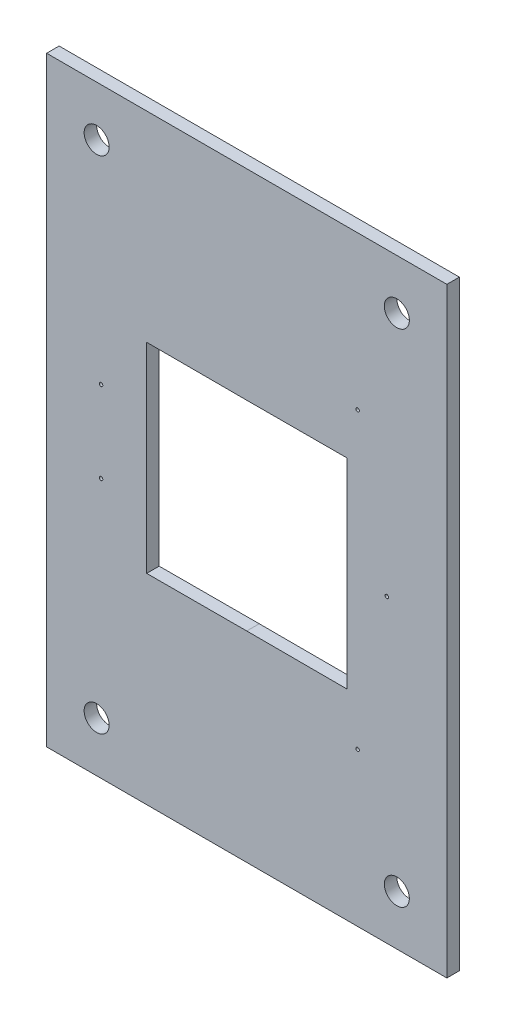
ISO-10303-21;
HEADER;
FILE_DESCRIPTION(('STEP AP214'),'2;1');
FILE_NAME('part.step','',(''),(''),'','','');
FILE_SCHEMA(('AUTOMOTIVE_DESIGN { 1 0 10303 214 1 1 1 1 }'));
ENDSEC;
DATA;
#1=APPLICATION_CONTEXT('core data for automotive mechanical design processes');
#2=APPLICATION_PROTOCOL_DEFINITION('international standard','automotive_design',2000,#1);
#3=PRODUCT_CONTEXT('',#1,'mechanical');
#4=PRODUCT('Part','Part','',(#3));
#5=PRODUCT_RELATED_PRODUCT_CATEGORY('part','',(#4));
#6=PRODUCT_DEFINITION_FORMATION('','',#4);
#7=PRODUCT_DEFINITION_CONTEXT('part definition',#1,'design');
#8=PRODUCT_DEFINITION('design','',#6,#7);
#9=PRODUCT_DEFINITION_SHAPE('','',#8);
#10=(LENGTH_UNIT() NAMED_UNIT(*) SI_UNIT(.MILLI.,.METRE.));
#11=(NAMED_UNIT(*) PLANE_ANGLE_UNIT() SI_UNIT($,.RADIAN.));
#12=(NAMED_UNIT(*) SI_UNIT($,.STERADIAN.) SOLID_ANGLE_UNIT());
#13=UNCERTAINTY_MEASURE_WITH_UNIT(LENGTH_MEASURE(1.E-05),#10,'distance_accuracy_value','');
#14=(GEOMETRIC_REPRESENTATION_CONTEXT(3) GLOBAL_UNCERTAINTY_ASSIGNED_CONTEXT((#13)) GLOBAL_UNIT_ASSIGNED_CONTEXT((#10,
#11,#12)) REPRESENTATION_CONTEXT('',''));
#15=CARTESIAN_POINT('',(0.,0.,0.));
#16=DIRECTION('',(0.,0.,1.));
#17=DIRECTION('',(1.,0.,0.));
#18=AXIS2_PLACEMENT_3D('',#15,#16,#17);
#19=CARTESIAN_POINT('',(390.62322075841,-119.382866825625,3.175));
#20=DIRECTION('',(0.,0.,-1.));
#21=DIRECTION('',(-1.,0.,0.));
#22=AXIS2_PLACEMENT_3D('',#19,#20,#21);
#23=PLANE('',#22);
#24=CARTESIAN_POINT('',(377.92322075841,-106.682866825625,3.175));
#25=DIRECTION('',(0.,0.,1.));
#26=DIRECTION('',(-1.,0.,0.));
#27=AXIS2_PLACEMENT_3D('',#24,#25,#26);
#28=CIRCLE('',#27,3.17499999999996);
#29=CARTESIAN_POINT('',(374.74822075841,-106.682866825625,3.175));
#30=VERTEX_POINT('',#29);
#31=EDGE_CURVE('E235',#30,#30,#28,.T.);
#32=ORIENTED_EDGE('',*,*,#31,.F.);
#33=EDGE_LOOP('',(#32));
#34=FACE_BOUND('',#33,.T.);
#35=CARTESIAN_POINT('',(301.72322075841,-106.682866825625,3.175));
#36=DIRECTION('',(0.,0.,1.));
#37=DIRECTION('',(1.,0.,0.));
#38=AXIS2_PLACEMENT_3D('',#35,#36,#37);
#39=CIRCLE('',#38,3.17499999999996);
#40=CARTESIAN_POINT('',(304.89822075841,-106.682866825625,3.175));
#41=VERTEX_POINT('',#40);
#42=EDGE_CURVE('E225',#41,#41,#39,.T.);
#43=ORIENTED_EDGE('',*,*,#42,.F.);
#44=EDGE_LOOP('',(#43));
#45=FACE_BOUND('',#44,.T.);
#46=CARTESIAN_POINT('',(301.72322075841,20.4080385220846,3.175));
#47=DIRECTION('',(0.,0.,1.));
#48=DIRECTION('',(-1.,0.,0.));
#49=AXIS2_PLACEMENT_3D('',#46,#47,#48);
#50=CIRCLE('',#49,3.17499999999997);
#51=CARTESIAN_POINT('',(298.54822075841,20.4080385220846,3.175));
#52=VERTEX_POINT('',#51);
#53=EDGE_CURVE('E222',#52,#52,#50,.T.);
#54=ORIENTED_EDGE('',*,*,#53,.F.);
#55=EDGE_LOOP('',(#54));
#56=FACE_BOUND('',#55,.T.);
#57=CARTESIAN_POINT('',(377.92322075841,20.4080385220846,3.175));
#58=DIRECTION('',(0.,0.,1.));
#59=DIRECTION('',(1.,0.,0.));
#60=AXIS2_PLACEMENT_3D('',#57,#58,#59);
#61=CIRCLE('',#60,3.17499999999997);
#62=CARTESIAN_POINT('',(381.09822075841,20.4080385220846,3.175));
#63=VERTEX_POINT('',#62);
#64=EDGE_CURVE('E219',#63,#63,#61,.T.);
#65=ORIENTED_EDGE('',*,*,#64,.F.);
#66=EDGE_LOOP('',(#65));
#67=FACE_BOUND('',#66,.T.);
#68=DIRECTION('',(0.,-1.,0.));
#69=VECTOR('',#68,1.);
#70=CARTESIAN_POINT('',(314.42322075841,-17.7374141517705,3.175));
#71=LINE('',#70,#69);
#72=CARTESIAN_POINT('',(314.42322075841,-17.7374141517705,3.175));
#73=VERTEX_POINT('',#72);
#74=CARTESIAN_POINT('',(314.42322075841,-68.53741415177,3.175));
#75=VERTEX_POINT('',#74);
#76=EDGE_CURVE('E112',#73,#75,#71,.T.);
#77=ORIENTED_EDGE('',*,*,#76,.F.);
#78=DIRECTION('',(-0.999998705948562,0.00160875765775456,0.));
#79=VECTOR('',#78,1.);
#80=CARTESIAN_POINT('',(314.42322075841,-17.7374141517705,3.175));
#81=LINE('',#80,#79);
#82=CARTESIAN_POINT('',(339.82322075841,-17.7782766491557,3.175));
#83=VERTEX_POINT('',#82);
#84=EDGE_CURVE('E143',#83,#73,#81,.T.);
#85=ORIENTED_EDGE('',*,*,#84,.F.);
#86=DIRECTION('',(-0.999998705948562,-0.00160875765775456,0.));
#87=VECTOR('',#86,1.);
#88=CARTESIAN_POINT('',(365.22322075841,-17.7374141517705,3.175));
#89=LINE('',#88,#87);
#90=CARTESIAN_POINT('',(365.22322075841,-17.7374141517705,3.175));
#91=VERTEX_POINT('',#90);
#92=EDGE_CURVE('E141',#91,#83,#89,.T.);
#93=ORIENTED_EDGE('',*,*,#92,.F.);
#94=DIRECTION('',(0.,1.,0.));
#95=VECTOR('',#94,1.);
#96=CARTESIAN_POINT('',(365.22322075841,-17.7374141517705,3.175));
#97=LINE('',#96,#95);
#98=CARTESIAN_POINT('',(365.22322075841,-68.5374141517696,3.175));
#99=VERTEX_POINT('',#98);
#100=EDGE_CURVE('E136',#99,#91,#97,.T.);
#101=ORIENTED_EDGE('',*,*,#100,.F.);
#102=DIRECTION('',(0.999998705948562,-0.00160875765774677,0.));
#103=VECTOR('',#102,1.);
#104=CARTESIAN_POINT('',(365.22322075841,-68.5374141517696,3.175));
#105=LINE('',#104,#103);
#106=CARTESIAN_POINT('',(339.82322075841,-68.4965516543847,3.175));
#107=VERTEX_POINT('',#106);
#108=EDGE_CURVE('E134',#107,#99,#105,.T.);
#109=ORIENTED_EDGE('',*,*,#108,.F.);
#110=DIRECTION('',(0.999998705948562,0.00160875765776207,0.));
#111=VECTOR('',#110,1.);
#112=CARTESIAN_POINT('',(314.42322075841,-68.53741415177,3.175));
#113=LINE('',#112,#111);
#114=EDGE_CURVE('E120',#75,#107,#113,.T.);
#115=ORIENTED_EDGE('',*,*,#114,.F.);
#116=EDGE_LOOP('',(#77,#85,#93,#101,#109,#115));
#117=FACE_BOUND('',#116,.T.);
#118=CARTESIAN_POINT('',(375.390273380605,-43.1374141517705,3.175));
#119=DIRECTION('',(0.,0.,1.));
#120=DIRECTION('',(1.,0.,0.));
#121=AXIS2_PLACEMENT_3D('',#118,#119,#120);
#122=CIRCLE('',#121,0.450000000000002);
#123=CARTESIAN_POINT('',(375.840273380605,-43.1374141517705,3.175));
#124=VERTEX_POINT('',#123);
#125=EDGE_CURVE('E172',#124,#124,#122,.T.);
#126=ORIENTED_EDGE('',*,*,#125,.F.);
#127=EDGE_LOOP('',(#126));
#128=FACE_BOUND('',#127,.T.);
#129=CARTESIAN_POINT('',(302.83502075841,-32.8049614779154,3.175));
#130=DIRECTION('',(0.,0.,1.));
#131=DIRECTION('',(1.,0.,0.));
#132=AXIS2_PLACEMENT_3D('',#129,#130,#131);
#133=CIRCLE('',#132,0.450000000000002);
#134=CARTESIAN_POINT('',(303.28502075841,-32.8049614779154,3.175));
#135=VERTEX_POINT('',#134);
#136=EDGE_CURVE('E184',#135,#135,#133,.T.);
#137=ORIENTED_EDGE('',*,*,#136,.F.);
#138=EDGE_LOOP('',(#137));
#139=FACE_BOUND('',#138,.T.);
#140=DIRECTION('',(1.,0.,0.));
#141=VECTOR('',#140,1.);
#142=CARTESIAN_POINT('',(289.02322075841,-119.382866825625,3.175));
#143=LINE('',#142,#141);
#144=CARTESIAN_POINT('',(289.02322075841,-119.382866825625,3.175));
#145=VERTEX_POINT('',#144);
#146=CARTESIAN_POINT('',(390.62322075841,-119.382866825625,3.175));
#147=VERTEX_POINT('',#146);
#148=EDGE_CURVE('E190',#145,#147,#143,.T.);
#149=ORIENTED_EDGE('',*,*,#148,.T.);
#150=DIRECTION('',(0.,1.,0.));
#151=VECTOR('',#150,1.);
#152=CARTESIAN_POINT('',(390.62322075841,33.1080385220846,3.175));
#153=LINE('',#152,#151);
#154=CARTESIAN_POINT('',(390.62322075841,33.1080385220846,3.175));
#155=VERTEX_POINT('',#154);
#156=EDGE_CURVE('E193',#147,#155,#153,.T.);
#157=ORIENTED_EDGE('',*,*,#156,.T.);
#158=DIRECTION('',(-1.,0.,0.));
#159=VECTOR('',#158,1.);
#160=CARTESIAN_POINT('',(390.62322075841,33.1080385220846,3.175));
#161=LINE('',#160,#159);
#162=CARTESIAN_POINT('',(289.02322075841,33.1080385220846,3.175));
#163=VERTEX_POINT('',#162);
#164=EDGE_CURVE('E196',#155,#163,#161,.T.);
#165=ORIENTED_EDGE('',*,*,#164,.T.);
#166=DIRECTION('',(0.,-1.,0.));
#167=VECTOR('',#166,1.);
#168=CARTESIAN_POINT('',(289.02322075841,33.1080385220846,3.175));
#169=LINE('',#168,#167);
#170=EDGE_CURVE('E198',#163,#145,#169,.T.);
#171=ORIENTED_EDGE('',*,*,#170,.T.);
#172=EDGE_LOOP('',(#149,#157,#165,#171));
#173=FACE_BOUND('',#172,.T.);
#174=CARTESIAN_POINT('',(367.968527800456,-5.82577949617655,3.175));
#175=DIRECTION('',(0.,0.,1.));
#176=DIRECTION('',(1.,0.,0.));
#177=AXIS2_PLACEMENT_3D('',#174,#175,#176);
#178=CIRCLE('',#177,0.450000000000002);
#179=CARTESIAN_POINT('',(368.418527800456,-5.82577949617655,3.175));
#180=VERTEX_POINT('',#179);
#181=EDGE_CURVE('E178',#180,#180,#178,.T.);
#182=ORIENTED_EDGE('',*,*,#181,.F.);
#183=EDGE_LOOP('',(#182));
#184=FACE_BOUND('',#183,.T.);
#185=CARTESIAN_POINT('',(302.83502075841,-53.4698668256257,3.175));
#186=DIRECTION('',(0.,0.,1.));
#187=DIRECTION('',(-1.,0.,0.));
#188=AXIS2_PLACEMENT_3D('',#185,#186,#187);
#189=CIRCLE('',#188,0.450000000000004);
#190=CARTESIAN_POINT('',(302.38502075841,-53.4698668256257,3.175));
#191=VERTEX_POINT('',#190);
#192=EDGE_CURVE('E166',#191,#191,#189,.T.);
#193=ORIENTED_EDGE('',*,*,#192,.F.);
#194=EDGE_LOOP('',(#193));
#195=FACE_BOUND('',#194,.T.);
#196=CARTESIAN_POINT('',(367.968527800455,-80.449048807366,3.175));
#197=DIRECTION('',(0.,0.,1.));
#198=DIRECTION('',(-1.,0.,0.));
#199=AXIS2_PLACEMENT_3D('',#196,#197,#198);
#200=CIRCLE('',#199,0.450000000000012);
#201=CARTESIAN_POINT('',(367.518527800455,-80.449048807366,3.175));
#202=VERTEX_POINT('',#201);
#203=EDGE_CURVE('E146',#202,#202,#200,.T.);
#204=ORIENTED_EDGE('',*,*,#203,.F.);
#205=EDGE_LOOP('',(#204));
#206=FACE_BOUND('',#205,.T.);
#207=ADVANCED_FACE('F33',(#34,#45,#56,#67,#117,#128,#139,#173,#184,#195,#206),#23,.F.);
#208=CARTESIAN_POINT('',(390.62322075841,-119.382866825625,0.));
#209=DIRECTION('',(0.,0.,-1.));
#210=DIRECTION('',(-1.,0.,0.));
#211=AXIS2_PLACEMENT_3D('',#208,#209,#210);
#212=PLANE('',#211);
#213=CARTESIAN_POINT('',(377.92322075841,-106.682866825625,0.));
#214=DIRECTION('',(0.,0.,-1.));
#215=DIRECTION('',(-1.,0.,0.));
#216=AXIS2_PLACEMENT_3D('',#213,#214,#215);
#217=CIRCLE('',#216,3.17499999999996);
#218=CARTESIAN_POINT('',(374.74822075841,-106.682866825625,0.));
#219=VERTEX_POINT('',#218);
#220=EDGE_CURVE('E37',#219,#219,#217,.T.);
#221=ORIENTED_EDGE('',*,*,#220,.F.);
#222=EDGE_LOOP('',(#221));
#223=FACE_BOUND('',#222,.T.);
#224=CARTESIAN_POINT('',(301.72322075841,-106.682866825625,0.));
#225=DIRECTION('',(0.,0.,-1.));
#226=DIRECTION('',(-1.,0.,0.));
#227=AXIS2_PLACEMENT_3D('',#224,#225,#226);
#228=CIRCLE('',#227,3.17499999999996);
#229=CARTESIAN_POINT('',(298.54822075841,-106.682866825625,0.));
#230=VERTEX_POINT('',#229);
#231=EDGE_CURVE('E223',#230,#230,#228,.T.);
#232=ORIENTED_EDGE('',*,*,#231,.F.);
#233=EDGE_LOOP('',(#232));
#234=FACE_BOUND('',#233,.T.);
#235=CARTESIAN_POINT('',(301.72322075841,20.4080385220846,0.));
#236=DIRECTION('',(0.,0.,-1.));
#237=DIRECTION('',(-1.,0.,0.));
#238=AXIS2_PLACEMENT_3D('',#235,#236,#237);
#239=CIRCLE('',#238,3.17499999999997);
#240=CARTESIAN_POINT('',(298.54822075841,20.4080385220846,0.));
#241=VERTEX_POINT('',#240);
#242=EDGE_CURVE('E220',#241,#241,#239,.T.);
#243=ORIENTED_EDGE('',*,*,#242,.F.);
#244=EDGE_LOOP('',(#243));
#245=FACE_BOUND('',#244,.T.);
#246=CARTESIAN_POINT('',(377.92322075841,20.4080385220846,0.));
#247=DIRECTION('',(0.,0.,-1.));
#248=DIRECTION('',(-1.,0.,0.));
#249=AXIS2_PLACEMENT_3D('',#246,#247,#248);
#250=CIRCLE('',#249,3.17499999999997);
#251=CARTESIAN_POINT('',(374.74822075841,20.4080385220846,0.));
#252=VERTEX_POINT('',#251);
#253=EDGE_CURVE('E215',#252,#252,#250,.T.);
#254=ORIENTED_EDGE('',*,*,#253,.F.);
#255=EDGE_LOOP('',(#254));
#256=FACE_BOUND('',#255,.T.);
#257=DIRECTION('',(-0.999998705948562,0.00160875765775456,0.));
#258=VECTOR('',#257,1.);
#259=CARTESIAN_POINT('',(314.42322075841,-17.7374141517705,0.));
#260=LINE('',#259,#258);
#261=CARTESIAN_POINT('',(339.82322075841,-17.7782766491557,0.));
#262=VERTEX_POINT('',#261);
#263=CARTESIAN_POINT('',(314.42322075841,-17.7374141517706,0.));
#264=VERTEX_POINT('',#263);
#265=EDGE_CURVE('E121',#262,#264,#260,.T.);
#266=ORIENTED_EDGE('',*,*,#265,.T.);
#267=DIRECTION('',(0.,-1.,0.));
#268=VECTOR('',#267,1.);
#269=CARTESIAN_POINT('',(314.42322075841,-17.7374141517705,0.));
#270=LINE('',#269,#268);
#271=CARTESIAN_POINT('',(314.42322075841,-68.53741415177,0.));
#272=VERTEX_POINT('',#271);
#273=EDGE_CURVE('E58',#264,#272,#270,.T.);
#274=ORIENTED_EDGE('',*,*,#273,.T.);
#275=DIRECTION('',(0.999998705948562,0.00160875765776207,0.));
#276=VECTOR('',#275,1.);
#277=CARTESIAN_POINT('',(314.42322075841,-68.53741415177,0.));
#278=LINE('',#277,#276);
#279=CARTESIAN_POINT('',(339.82322075841,-68.4965516543847,0.));
#280=VERTEX_POINT('',#279);
#281=EDGE_CURVE('E127',#272,#280,#278,.T.);
#282=ORIENTED_EDGE('',*,*,#281,.T.);
#283=DIRECTION('',(0.999998705948562,-0.00160875765774677,0.));
#284=VECTOR('',#283,1.);
#285=CARTESIAN_POINT('',(365.22322075841,-68.5374141517696,0.));
#286=LINE('',#285,#284);
#287=CARTESIAN_POINT('',(365.22322075841,-68.5374141517696,0.));
#288=VERTEX_POINT('',#287);
#289=EDGE_CURVE('E148',#280,#288,#286,.T.);
#290=ORIENTED_EDGE('',*,*,#289,.T.);
#291=DIRECTION('',(0.,1.,0.));
#292=VECTOR('',#291,1.);
#293=CARTESIAN_POINT('',(365.22322075841,-17.7374141517705,0.));
#294=LINE('',#293,#292);
#295=CARTESIAN_POINT('',(365.22322075841,-17.7374141517705,0.));
#296=VERTEX_POINT('',#295);
#297=EDGE_CURVE('E151',#288,#296,#294,.T.);
#298=ORIENTED_EDGE('',*,*,#297,.T.);
#299=DIRECTION('',(-0.999998705948562,-0.00160875765775456,0.));
#300=VECTOR('',#299,1.);
#301=CARTESIAN_POINT('',(365.22322075841,-17.7374141517705,0.));
#302=LINE('',#301,#300);
#303=EDGE_CURVE('E154',#296,#262,#302,.T.);
#304=ORIENTED_EDGE('',*,*,#303,.T.);
#305=EDGE_LOOP('',(#266,#274,#282,#290,#298,#304));
#306=FACE_BOUND('',#305,.T.);
#307=CARTESIAN_POINT('',(375.390273380605,-43.1374141517705,0.));
#308=DIRECTION('',(0.,0.,1.));
#309=DIRECTION('',(1.,0.,0.));
#310=AXIS2_PLACEMENT_3D('',#307,#308,#309);
#311=CIRCLE('',#310,0.450000000000002);
#312=CARTESIAN_POINT('',(375.840273380605,-43.1374141517705,0.));
#313=VERTEX_POINT('',#312);
#314=EDGE_CURVE('E169',#313,#313,#311,.T.);
#315=ORIENTED_EDGE('',*,*,#314,.T.);
#316=EDGE_LOOP('',(#315));
#317=FACE_BOUND('',#316,.T.);
#318=CARTESIAN_POINT('',(302.83502075841,-32.8049614779154,0.));
#319=DIRECTION('',(0.,0.,1.));
#320=DIRECTION('',(1.,0.,0.));
#321=AXIS2_PLACEMENT_3D('',#318,#319,#320);
#322=CIRCLE('',#321,0.450000000000002);
#323=CARTESIAN_POINT('',(303.28502075841,-32.8049614779154,0.));
#324=VERTEX_POINT('',#323);
#325=EDGE_CURVE('E181',#324,#324,#322,.T.);
#326=ORIENTED_EDGE('',*,*,#325,.T.);
#327=EDGE_LOOP('',(#326));
#328=FACE_BOUND('',#327,.T.);
#329=DIRECTION('',(1.,0.,0.));
#330=VECTOR('',#329,1.);
#331=CARTESIAN_POINT('',(289.02322075841,-119.382866825625,0.));
#332=LINE('',#331,#330);
#333=CARTESIAN_POINT('',(289.02322075841,-119.382866825625,0.));
#334=VERTEX_POINT('',#333);
#335=CARTESIAN_POINT('',(390.62322075841,-119.382866825625,0.));
#336=VERTEX_POINT('',#335);
#337=EDGE_CURVE('E187',#334,#336,#332,.T.);
#338=ORIENTED_EDGE('',*,*,#337,.F.);
#339=DIRECTION('',(0.,-1.,0.));
#340=VECTOR('',#339,1.);
#341=CARTESIAN_POINT('',(289.02322075841,33.1080385220846,0.));
#342=LINE('',#341,#340);
#343=CARTESIAN_POINT('',(289.02322075841,33.1080385220846,0.));
#344=VERTEX_POINT('',#343);
#345=EDGE_CURVE('E194',#344,#334,#342,.T.);
#346=ORIENTED_EDGE('',*,*,#345,.F.);
#347=DIRECTION('',(-1.,0.,0.));
#348=VECTOR('',#347,1.);
#349=CARTESIAN_POINT('',(390.62322075841,33.1080385220846,0.));
#350=LINE('',#349,#348);
#351=CARTESIAN_POINT('',(390.62322075841,33.1080385220846,0.));
#352=VERTEX_POINT('',#351);
#353=EDGE_CURVE('E205',#352,#344,#350,.T.);
#354=ORIENTED_EDGE('',*,*,#353,.F.);
#355=DIRECTION('',(0.,1.,0.));
#356=VECTOR('',#355,1.);
#357=CARTESIAN_POINT('',(390.62322075841,33.1080385220846,0.));
#358=LINE('',#357,#356);
#359=EDGE_CURVE('E203',#336,#352,#358,.T.);
#360=ORIENTED_EDGE('',*,*,#359,.F.);
#361=EDGE_LOOP('',(#338,#346,#354,#360));
#362=FACE_BOUND('',#361,.T.);
#363=CARTESIAN_POINT('',(367.968527800456,-5.82577949617655,0.));
#364=DIRECTION('',(0.,0.,1.));
#365=DIRECTION('',(1.,0.,0.));
#366=AXIS2_PLACEMENT_3D('',#363,#364,#365);
#367=CIRCLE('',#366,0.450000000000002);
#368=CARTESIAN_POINT('',(368.418527800456,-5.82577949617655,0.));
#369=VERTEX_POINT('',#368);
#370=EDGE_CURVE('E175',#369,#369,#367,.T.);
#371=ORIENTED_EDGE('',*,*,#370,.T.);
#372=EDGE_LOOP('',(#371));
#373=FACE_BOUND('',#372,.T.);
#374=CARTESIAN_POINT('',(302.83502075841,-53.4698668256257,0.));
#375=DIRECTION('',(0.,0.,1.));
#376=DIRECTION('',(-1.,0.,0.));
#377=AXIS2_PLACEMENT_3D('',#374,#375,#376);
#378=CIRCLE('',#377,0.450000000000004);
#379=CARTESIAN_POINT('',(302.38502075841,-53.4698668256257,0.));
#380=VERTEX_POINT('',#379);
#381=EDGE_CURVE('E128',#380,#380,#378,.T.);
#382=ORIENTED_EDGE('',*,*,#381,.T.);
#383=EDGE_LOOP('',(#382));
#384=FACE_BOUND('',#383,.T.);
#385=CARTESIAN_POINT('',(367.968527800455,-80.449048807366,0.));
#386=DIRECTION('',(0.,0.,1.));
#387=DIRECTION('',(-1.,0.,0.));
#388=AXIS2_PLACEMENT_3D('',#385,#386,#387);
#389=CIRCLE('',#388,0.450000000000012);
#390=CARTESIAN_POINT('',(367.518527800455,-80.449048807366,0.));
#391=VERTEX_POINT('',#390);
#392=EDGE_CURVE('E218',#391,#391,#389,.T.);
#393=ORIENTED_EDGE('',*,*,#392,.T.);
#394=EDGE_LOOP('',(#393));
#395=FACE_BOUND('',#394,.T.);
#396=ADVANCED_FACE('F244',(#223,#234,#245,#256,#306,#317,#328,#362,#373,#384,#395),#212,.T.);
#397=CARTESIAN_POINT('',(289.02322075841,-119.382866825625,3.175));
#398=DIRECTION('',(0.,1.,0.));
#399=DIRECTION('',(0.,0.,1.));
#400=AXIS2_PLACEMENT_3D('',#397,#398,#399);
#401=PLANE('',#400);
#402=ORIENTED_EDGE('',*,*,#337,.T.);
#403=DIRECTION('',(0.,0.,-1.));
#404=VECTOR('',#403,1.);
#405=CARTESIAN_POINT('',(390.62322075841,-119.382866825625,3.175));
#406=LINE('',#405,#404);
#407=EDGE_CURVE('E11',#147,#336,#406,.T.);
#408=ORIENTED_EDGE('',*,*,#407,.F.);
#409=ORIENTED_EDGE('',*,*,#148,.F.);
#410=DIRECTION('',(0.,0.,-1.));
#411=VECTOR('',#410,1.);
#412=CARTESIAN_POINT('',(289.02322075841,-119.382866825625,3.175));
#413=LINE('',#412,#411);
#414=EDGE_CURVE('E200',#145,#334,#413,.T.);
#415=ORIENTED_EDGE('',*,*,#414,.T.);
#416=EDGE_LOOP('',(#402,#408,#409,#415));
#417=FACE_BOUND('',#416,.T.);
#418=ADVANCED_FACE('F35',(#417),#401,.F.);
#419=CARTESIAN_POINT('',(390.62322075841,33.1080385220846,3.175));
#420=DIRECTION('',(-1.,0.,0.));
#421=DIRECTION('',(0.,0.,1.));
#422=AXIS2_PLACEMENT_3D('',#419,#420,#421);
#423=PLANE('',#422);
#424=ORIENTED_EDGE('',*,*,#359,.T.);
#425=DIRECTION('',(0.,0.,-1.));
#426=VECTOR('',#425,1.);
#427=CARTESIAN_POINT('',(390.62322075841,33.1080385220846,3.175));
#428=LINE('',#427,#426);
#429=EDGE_CURVE('E42',#155,#352,#428,.T.);
#430=ORIENTED_EDGE('',*,*,#429,.F.);
#431=ORIENTED_EDGE('',*,*,#156,.F.);
#432=ORIENTED_EDGE('',*,*,#407,.T.);
#433=EDGE_LOOP('',(#424,#430,#431,#432));
#434=FACE_BOUND('',#433,.T.);
#435=ADVANCED_FACE('F281',(#434),#423,.F.);
#436=CARTESIAN_POINT('',(390.62322075841,33.1080385220846,3.175));
#437=DIRECTION('',(0.,-1.,0.));
#438=DIRECTION('',(0.,0.,-1.));
#439=AXIS2_PLACEMENT_3D('',#436,#437,#438);
#440=PLANE('',#439);
#441=ORIENTED_EDGE('',*,*,#353,.T.);
#442=DIRECTION('',(0.,0.,-1.));
#443=VECTOR('',#442,1.);
#444=CARTESIAN_POINT('',(289.02322075841,33.1080385220846,3.175));
#445=LINE('',#444,#443);
#446=EDGE_CURVE('E210',#163,#344,#445,.T.);
#447=ORIENTED_EDGE('',*,*,#446,.F.);
#448=ORIENTED_EDGE('',*,*,#164,.F.);
#449=ORIENTED_EDGE('',*,*,#429,.T.);
#450=EDGE_LOOP('',(#441,#447,#448,#449));
#451=FACE_BOUND('',#450,.T.);
#452=ADVANCED_FACE('F278',(#451),#440,.F.);
#453=CARTESIAN_POINT('',(289.02322075841,33.1080385220846,3.175));
#454=DIRECTION('',(1.,0.,0.));
#455=DIRECTION('',(0.,0.,-1.));
#456=AXIS2_PLACEMENT_3D('',#453,#454,#455);
#457=PLANE('',#456);
#458=ORIENTED_EDGE('',*,*,#345,.T.);
#459=ORIENTED_EDGE('',*,*,#414,.F.);
#460=ORIENTED_EDGE('',*,*,#170,.F.);
#461=ORIENTED_EDGE('',*,*,#446,.T.);
#462=EDGE_LOOP('',(#458,#459,#460,#461));
#463=FACE_BOUND('',#462,.T.);
#464=ADVANCED_FACE('F275',(#463),#457,.F.);
#465=CARTESIAN_POINT('',(302.83502075841,-32.8049614779154,3.175));
#466=DIRECTION('',(0.,0.,-1.));
#467=DIRECTION('',(-1.,0.,0.));
#468=AXIS2_PLACEMENT_3D('',#465,#466,#467);
#469=CYLINDRICAL_SURFACE('',#468,0.450000000000002);
#470=ORIENTED_EDGE('',*,*,#136,.T.);
#471=EDGE_LOOP('',(#470));
#472=FACE_BOUND('',#471,.T.);
#473=ORIENTED_EDGE('',*,*,#325,.F.);
#474=EDGE_LOOP('',(#473));
#475=FACE_BOUND('',#474,.T.);
#476=ADVANCED_FACE('F272',(#472,#475),#469,.F.);
#477=CARTESIAN_POINT('',(367.968527800456,-5.82577949617655,3.175));
#478=DIRECTION('',(0.,0.,-1.));
#479=DIRECTION('',(-1.,0.,0.));
#480=AXIS2_PLACEMENT_3D('',#477,#478,#479);
#481=CYLINDRICAL_SURFACE('',#480,0.450000000000002);
#482=ORIENTED_EDGE('',*,*,#181,.T.);
#483=EDGE_LOOP('',(#482));
#484=FACE_BOUND('',#483,.T.);
#485=ORIENTED_EDGE('',*,*,#370,.F.);
#486=EDGE_LOOP('',(#485));
#487=FACE_BOUND('',#486,.T.);
#488=ADVANCED_FACE('F321',(#484,#487),#481,.F.);
#489=CARTESIAN_POINT('',(375.390273380605,-43.1374141517705,3.175));
#490=DIRECTION('',(0.,0.,-1.));
#491=DIRECTION('',(-1.,0.,0.));
#492=AXIS2_PLACEMENT_3D('',#489,#490,#491);
#493=CYLINDRICAL_SURFACE('',#492,0.450000000000002);
#494=ORIENTED_EDGE('',*,*,#125,.T.);
#495=EDGE_LOOP('',(#494));
#496=FACE_BOUND('',#495,.T.);
#497=ORIENTED_EDGE('',*,*,#314,.F.);
#498=EDGE_LOOP('',(#497));
#499=FACE_BOUND('',#498,.T.);
#500=ADVANCED_FACE('F312',(#496,#499),#493,.F.);
#501=CARTESIAN_POINT('',(302.83502075841,-53.4698668256257,3.175));
#502=DIRECTION('',(0.,0.,-1.));
#503=DIRECTION('',(-1.,0.,0.));
#504=AXIS2_PLACEMENT_3D('',#501,#502,#503);
#505=CYLINDRICAL_SURFACE('',#504,0.450000000000004);
#506=ORIENTED_EDGE('',*,*,#192,.T.);
#507=EDGE_LOOP('',(#506));
#508=FACE_BOUND('',#507,.T.);
#509=ORIENTED_EDGE('',*,*,#381,.F.);
#510=EDGE_LOOP('',(#509));
#511=FACE_BOUND('',#510,.T.);
#512=ADVANCED_FACE('F309',(#508,#511),#505,.F.);
#513=CARTESIAN_POINT('',(314.42322075841,-17.7374141517705,3.175));
#514=DIRECTION('',(1.,0.,0.));
#515=DIRECTION('',(0.,1.,0.));
#516=AXIS2_PLACEMENT_3D('',#513,#514,#515);
#517=PLANE('',#516);
#518=ORIENTED_EDGE('',*,*,#273,.F.);
#519=DIRECTION('',(0.,0.,-1.));
#520=VECTOR('',#519,1.);
#521=CARTESIAN_POINT('',(314.42322075841,-17.7374141517705,3.175));
#522=LINE('',#521,#520);
#523=EDGE_CURVE('E116',#73,#264,#522,.T.);
#524=ORIENTED_EDGE('',*,*,#523,.F.);
#525=ORIENTED_EDGE('',*,*,#76,.T.);
#526=DIRECTION('',(0.,0.,-1.));
#527=VECTOR('',#526,1.);
#528=CARTESIAN_POINT('',(314.42322075841,-68.53741415177,3.175));
#529=LINE('',#528,#527);
#530=EDGE_CURVE('E115',#75,#272,#529,.T.);
#531=ORIENTED_EDGE('',*,*,#530,.T.);
#532=EDGE_LOOP('',(#518,#524,#525,#531));
#533=FACE_BOUND('',#532,.T.);
#534=ADVANCED_FACE('F114',(#533),#517,.T.);
#535=CARTESIAN_POINT('',(314.42322075841,-68.53741415177,3.175));
#536=DIRECTION('',(-0.00160875765776207,0.999998705948562,0.));
#537=DIRECTION('',(-0.999998705948562,-0.00160875765776207,0.));
#538=AXIS2_PLACEMENT_3D('',#535,#536,#537);
#539=PLANE('',#538);
#540=ORIENTED_EDGE('',*,*,#281,.F.);
#541=ORIENTED_EDGE('',*,*,#530,.F.);
#542=ORIENTED_EDGE('',*,*,#114,.T.);
#543=DIRECTION('',(0.,0.,-1.));
#544=VECTOR('',#543,1.);
#545=CARTESIAN_POINT('',(339.82322075841,-68.4965516543847,3.175));
#546=LINE('',#545,#544);
#547=EDGE_CURVE('E129',#107,#280,#546,.T.);
#548=ORIENTED_EDGE('',*,*,#547,.T.);
#549=EDGE_LOOP('',(#540,#541,#542,#548));
#550=FACE_BOUND('',#549,.T.);
#551=ADVANCED_FACE('F124',(#550),#539,.T.);
#552=CARTESIAN_POINT('',(365.22322075841,-68.5374141517696,3.175));
#553=DIRECTION('',(0.00160875765774677,0.999998705948562,0.));
#554=DIRECTION('',(-0.999998705948562,0.00160875765774677,0.));
#555=AXIS2_PLACEMENT_3D('',#552,#553,#554);
#556=PLANE('',#555);
#557=ORIENTED_EDGE('',*,*,#289,.F.);
#558=ORIENTED_EDGE('',*,*,#547,.F.);
#559=ORIENTED_EDGE('',*,*,#108,.T.);
#560=DIRECTION('',(0.,0.,-1.));
#561=VECTOR('',#560,1.);
#562=CARTESIAN_POINT('',(365.22322075841,-68.5374141517696,3.175));
#563=LINE('',#562,#561);
#564=EDGE_CURVE('E163',#99,#288,#563,.T.);
#565=ORIENTED_EDGE('',*,*,#564,.T.);
#566=EDGE_LOOP('',(#557,#558,#559,#565));
#567=FACE_BOUND('',#566,.T.);
#568=ADVANCED_FACE('F429',(#567),#556,.T.);
#569=CARTESIAN_POINT('',(365.22322075841,-17.7374141517705,3.175));
#570=DIRECTION('',(-1.,0.,0.));
#571=DIRECTION('',(0.,-1.,0.));
#572=AXIS2_PLACEMENT_3D('',#569,#570,#571);
#573=PLANE('',#572);
#574=ORIENTED_EDGE('',*,*,#297,.F.);
#575=ORIENTED_EDGE('',*,*,#564,.F.);
#576=ORIENTED_EDGE('',*,*,#100,.T.);
#577=DIRECTION('',(0.,0.,-1.));
#578=VECTOR('',#577,1.);
#579=CARTESIAN_POINT('',(365.22322075841,-17.7374141517705,3.175));
#580=LINE('',#579,#578);
#581=EDGE_CURVE('E161',#91,#296,#580,.T.);
#582=ORIENTED_EDGE('',*,*,#581,.T.);
#583=EDGE_LOOP('',(#574,#575,#576,#582));
#584=FACE_BOUND('',#583,.T.);
#585=ADVANCED_FACE('F425',(#584),#573,.T.);
#586=CARTESIAN_POINT('',(365.22322075841,-17.7374141517705,3.175));
#587=DIRECTION('',(0.00160875765775456,-0.999998705948562,0.));
#588=DIRECTION('',(0.999998705948562,0.00160875765775456,0.));
#589=AXIS2_PLACEMENT_3D('',#586,#587,#588);
#590=PLANE('',#589);
#591=ORIENTED_EDGE('',*,*,#303,.F.);
#592=ORIENTED_EDGE('',*,*,#581,.F.);
#593=ORIENTED_EDGE('',*,*,#92,.T.);
#594=DIRECTION('',(0.,0.,-1.));
#595=VECTOR('',#594,1.);
#596=CARTESIAN_POINT('',(339.82322075841,-17.7782766491557,3.175));
#597=LINE('',#596,#595);
#598=EDGE_CURVE('E50',#83,#262,#597,.T.);
#599=ORIENTED_EDGE('',*,*,#598,.T.);
#600=EDGE_LOOP('',(#591,#592,#593,#599));
#601=FACE_BOUND('',#600,.T.);
#602=ADVANCED_FACE('F259',(#601),#590,.T.);
#603=CARTESIAN_POINT('',(314.42322075841,-17.7374141517705,3.175));
#604=DIRECTION('',(-0.00160875765775456,-0.999998705948562,0.));
#605=DIRECTION('',(0.999998705948562,-0.00160875765775456,0.));
#606=AXIS2_PLACEMENT_3D('',#603,#604,#605);
#607=PLANE('',#606);
#608=ORIENTED_EDGE('',*,*,#265,.F.);
#609=ORIENTED_EDGE('',*,*,#598,.F.);
#610=ORIENTED_EDGE('',*,*,#84,.T.);
#611=ORIENTED_EDGE('',*,*,#523,.T.);
#612=EDGE_LOOP('',(#608,#609,#610,#611));
#613=FACE_BOUND('',#612,.T.);
#614=ADVANCED_FACE('F249',(#613),#607,.T.);
#615=CARTESIAN_POINT('',(367.968527800455,-80.449048807366,3.175));
#616=DIRECTION('',(0.,0.,-1.));
#617=DIRECTION('',(-1.,0.,0.));
#618=AXIS2_PLACEMENT_3D('',#615,#616,#617);
#619=CYLINDRICAL_SURFACE('',#618,0.450000000000012);
#620=ORIENTED_EDGE('',*,*,#203,.T.);
#621=EDGE_LOOP('',(#620));
#622=FACE_BOUND('',#621,.T.);
#623=ORIENTED_EDGE('',*,*,#392,.F.);
#624=EDGE_LOOP('',(#623));
#625=FACE_BOUND('',#624,.T.);
#626=ADVANCED_FACE('F246',(#622,#625),#619,.F.);
#627=CARTESIAN_POINT('',(377.92322075841,20.4080385220846,-6.825));
#628=DIRECTION('',(0.,0.,1.));
#629=DIRECTION('',(1.,0.,0.));
#630=AXIS2_PLACEMENT_3D('',#627,#628,#629);
#631=CYLINDRICAL_SURFACE('',#630,3.17499999999997);
#632=ORIENTED_EDGE('',*,*,#253,.T.);
#633=EDGE_LOOP('',(#632));
#634=FACE_BOUND('',#633,.T.);
#635=ORIENTED_EDGE('',*,*,#64,.T.);
#636=EDGE_LOOP('',(#635));
#637=FACE_BOUND('',#636,.T.);
#638=ADVANCED_FACE('F248',(#634,#637),#631,.F.);
#639=CARTESIAN_POINT('',(301.72322075841,20.4080385220846,-6.825));
#640=DIRECTION('',(0.,0.,1.));
#641=DIRECTION('',(1.,0.,0.));
#642=AXIS2_PLACEMENT_3D('',#639,#640,#641);
#643=CYLINDRICAL_SURFACE('',#642,3.17499999999997);
#644=ORIENTED_EDGE('',*,*,#242,.T.);
#645=EDGE_LOOP('',(#644));
#646=FACE_BOUND('',#645,.T.);
#647=ORIENTED_EDGE('',*,*,#53,.T.);
#648=EDGE_LOOP('',(#647));
#649=FACE_BOUND('',#648,.T.);
#650=ADVANCED_FACE('F256',(#646,#649),#643,.F.);
#651=CARTESIAN_POINT('',(301.72322075841,-106.682866825625,-6.825));
#652=DIRECTION('',(0.,0.,1.));
#653=DIRECTION('',(1.,0.,0.));
#654=AXIS2_PLACEMENT_3D('',#651,#652,#653);
#655=CYLINDRICAL_SURFACE('',#654,3.17499999999996);
#656=ORIENTED_EDGE('',*,*,#231,.T.);
#657=EDGE_LOOP('',(#656));
#658=FACE_BOUND('',#657,.T.);
#659=ORIENTED_EDGE('',*,*,#42,.T.);
#660=EDGE_LOOP('',(#659));
#661=FACE_BOUND('',#660,.T.);
#662=ADVANCED_FACE('F384',(#658,#661),#655,.F.);
#663=CARTESIAN_POINT('',(377.92322075841,-106.682866825625,-6.825));
#664=DIRECTION('',(0.,0.,1.));
#665=DIRECTION('',(1.,0.,0.));
#666=AXIS2_PLACEMENT_3D('',#663,#664,#665);
#667=CYLINDRICAL_SURFACE('',#666,3.17499999999996);
#668=ORIENTED_EDGE('',*,*,#220,.T.);
#669=EDGE_LOOP('',(#668));
#670=FACE_BOUND('',#669,.T.);
#671=ORIENTED_EDGE('',*,*,#31,.T.);
#672=EDGE_LOOP('',(#671));
#673=FACE_BOUND('',#672,.T.);
#674=ADVANCED_FACE('F394',(#670,#673),#667,.F.);
#675=CLOSED_SHELL('',(#207,#396,#418,#435,#452,#464,#476,#488,#500,#512,#534,#551,#568,#585,
#602,#614,#626,#638,#650,#662,#674));
#676=MANIFOLD_SOLID_BREP('B2',#675);
#677=ADVANCED_BREP_SHAPE_REPRESENTATION('',(#18,#676),#14);
#678=SHAPE_DEFINITION_REPRESENTATION(#9,#677);
ENDSEC;
END-ISO-10303-21;
